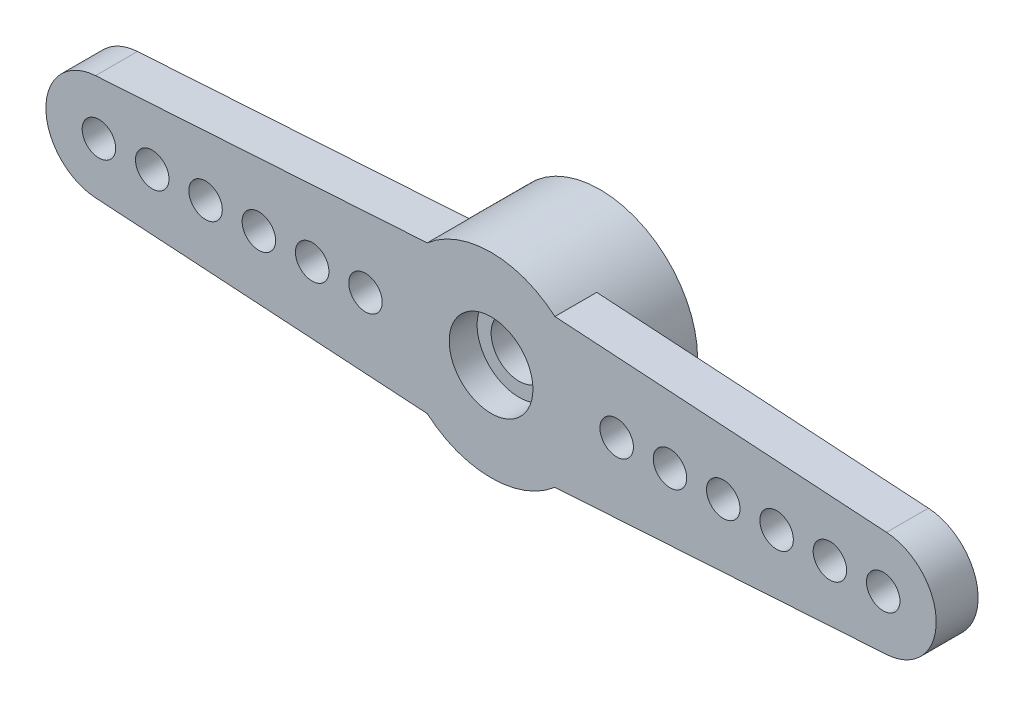
ISO-10303-21;
HEADER;
FILE_DESCRIPTION(('STEP AP214'),'2;1');
FILE_NAME('part.step','',(''),(''),'','','');
FILE_SCHEMA(('AUTOMOTIVE_DESIGN { 1 0 10303 214 1 1 1 1 }'));
ENDSEC;
DATA;
#1=APPLICATION_CONTEXT('core data for automotive mechanical design processes');
#2=APPLICATION_PROTOCOL_DEFINITION('international standard','automotive_design',2000,#1);
#3=PRODUCT_CONTEXT('',#1,'mechanical');
#4=PRODUCT('Part','Part','',(#3));
#5=PRODUCT_RELATED_PRODUCT_CATEGORY('part','',(#4));
#6=PRODUCT_DEFINITION_FORMATION('','',#4);
#7=PRODUCT_DEFINITION_CONTEXT('part definition',#1,'design');
#8=PRODUCT_DEFINITION('design','',#6,#7);
#9=PRODUCT_DEFINITION_SHAPE('','',#8);
#10=(LENGTH_UNIT() NAMED_UNIT(*) SI_UNIT(.MILLI.,.METRE.));
#11=(NAMED_UNIT(*) PLANE_ANGLE_UNIT() SI_UNIT($,.RADIAN.));
#12=(NAMED_UNIT(*) SI_UNIT($,.STERADIAN.) SOLID_ANGLE_UNIT());
#13=UNCERTAINTY_MEASURE_WITH_UNIT(LENGTH_MEASURE(1.E-05),#10,'distance_accuracy_value','');
#14=(GEOMETRIC_REPRESENTATION_CONTEXT(3) GLOBAL_UNCERTAINTY_ASSIGNED_CONTEXT((#13)) GLOBAL_UNIT_ASSIGNED_CONTEXT((#10,
#11,#12)) REPRESENTATION_CONTEXT('',''));
#15=CARTESIAN_POINT('',(0.,0.,0.));
#16=DIRECTION('',(0.,0.,1.));
#17=DIRECTION('',(1.,0.,0.));
#18=AXIS2_PLACEMENT_3D('',#15,#16,#17);
#19=CARTESIAN_POINT('',(0.,0.,3.9));
#20=DIRECTION('',(0.,0.,-1.));
#21=DIRECTION('',(-1.,0.,0.));
#22=AXIS2_PLACEMENT_3D('',#19,#20,#21);
#23=CYLINDRICAL_SURFACE('',#22,3.5);
#24=CARTESIAN_POINT('',(0.,0.,0.));
#25=DIRECTION('',(0.,0.,1.));
#26=DIRECTION('',(1.,0.,0.));
#27=AXIS2_PLACEMENT_3D('',#24,#25,#26);
#28=CIRCLE('',#27,3.5);
#29=CARTESIAN_POINT('',(3.5,0.,0.));
#30=VERTEX_POINT('',#29);
#31=EDGE_CURVE('E376',#30,#30,#28,.T.);
#32=ORIENTED_EDGE('',*,*,#31,.T.);
#33=EDGE_LOOP('',(#32));
#34=FACE_BOUND('',#33,.T.);
#35=DIRECTION('',(0.,0.,1.));
#36=VECTOR('',#35,1.);
#37=CARTESIAN_POINT('',(-2.28637267303474,2.65,2.4));
#38=LINE('',#37,#36);
#39=CARTESIAN_POINT('',(-2.28637267303474,2.65,2.4));
#40=VERTEX_POINT('',#39);
#41=CARTESIAN_POINT('',(-2.28637267303474,2.65,3.9));
#42=VERTEX_POINT('',#41);
#43=EDGE_CURVE('E317',#40,#42,#38,.T.);
#44=ORIENTED_EDGE('',*,*,#43,.T.);
#45=CARTESIAN_POINT('',(0.,0.,3.9));
#46=DIRECTION('',(0.,0.,1.));
#47=DIRECTION('',(1.,0.,0.));
#48=AXIS2_PLACEMENT_3D('',#45,#46,#47);
#49=CIRCLE('',#48,3.5);
#50=CARTESIAN_POINT('',(2.28637267303474,2.65,3.9));
#51=VERTEX_POINT('',#50);
#52=EDGE_CURVE('E12',#51,#42,#49,.T.);
#53=ORIENTED_EDGE('',*,*,#52,.F.);
#54=DIRECTION('',(0.,0.,1.));
#55=VECTOR('',#54,1.);
#56=CARTESIAN_POINT('',(2.28637267303474,2.65,2.4));
#57=LINE('',#56,#55);
#58=CARTESIAN_POINT('',(2.28637267303474,2.65,2.4));
#59=VERTEX_POINT('',#58);
#60=EDGE_CURVE('E368',#59,#51,#57,.T.);
#61=ORIENTED_EDGE('',*,*,#60,.F.);
#62=CARTESIAN_POINT('',(0.,0.,2.4));
#63=DIRECTION('',(0.,0.,1.));
#64=DIRECTION('',(1.,0.,0.));
#65=AXIS2_PLACEMENT_3D('',#62,#63,#64);
#66=CIRCLE('',#65,3.5);
#67=CARTESIAN_POINT('',(2.28637267303473,-2.65,2.4));
#68=VERTEX_POINT('',#67);
#69=EDGE_CURVE('E359',#68,#59,#66,.T.);
#70=ORIENTED_EDGE('',*,*,#69,.F.);
#71=DIRECTION('',(0.,0.,1.));
#72=VECTOR('',#71,1.);
#73=CARTESIAN_POINT('',(2.28637267303473,-2.65,2.4));
#74=LINE('',#73,#72);
#75=CARTESIAN_POINT('',(2.28637267303473,-2.65,3.9));
#76=VERTEX_POINT('',#75);
#77=EDGE_CURVE('E379',#68,#76,#74,.T.);
#78=ORIENTED_EDGE('',*,*,#77,.T.);
#79=CARTESIAN_POINT('',(-2.28637267303473,-2.65,3.9));
#80=VERTEX_POINT('',#79);
#81=EDGE_CURVE('E223',#80,#76,#49,.T.);
#82=ORIENTED_EDGE('',*,*,#81,.F.);
#83=DIRECTION('',(0.,0.,1.));
#84=VECTOR('',#83,1.);
#85=CARTESIAN_POINT('',(-2.28637267303474,-2.65,2.4));
#86=LINE('',#85,#84);
#87=CARTESIAN_POINT('',(-2.28637267303474,-2.65,2.4));
#88=VERTEX_POINT('',#87);
#89=EDGE_CURVE('E296',#88,#80,#86,.T.);
#90=ORIENTED_EDGE('',*,*,#89,.F.);
#91=CARTESIAN_POINT('',(0.,0.,2.4));
#92=DIRECTION('',(0.,0.,1.));
#93=DIRECTION('',(1.,0.,0.));
#94=AXIS2_PLACEMENT_3D('',#91,#92,#93);
#95=CIRCLE('',#94,3.5);
#96=EDGE_CURVE('E288',#40,#88,#95,.T.);
#97=ORIENTED_EDGE('',*,*,#96,.F.);
#98=EDGE_LOOP('',(#44,#53,#61,#70,#78,#82,#90,#97));
#99=FACE_BOUND('',#98,.T.);
#100=ADVANCED_FACE('F215',(#34,#99),#23,.T.);
#101=CARTESIAN_POINT('',(0.,0.,3.9));
#102=DIRECTION('',(0.,0.,1.));
#103=DIRECTION('',(1.,0.,0.));
#104=AXIS2_PLACEMENT_3D('',#101,#102,#103);
#105=PLANE('',#104);
#106=CARTESIAN_POINT('',(0.,0.,3.9));
#107=DIRECTION('',(0.,0.,1.));
#108=DIRECTION('',(1.,0.,0.));
#109=AXIS2_PLACEMENT_3D('',#106,#107,#108);
#110=CIRCLE('',#109,1.5);
#111=CARTESIAN_POINT('',(1.5,0.,3.9));
#112=VERTEX_POINT('',#111);
#113=EDGE_CURVE('E427',#112,#112,#110,.T.);
#114=ORIENTED_EDGE('',*,*,#113,.F.);
#115=EDGE_LOOP('',(#114));
#116=FACE_BOUND('',#115,.T.);
#117=ORIENTED_EDGE('',*,*,#52,.T.);
#118=DIRECTION('',(0.99799428926586,0.0633040171926833,0.));
#119=VECTOR('',#118,1.);
#120=CARTESIAN_POINT('',(-0.176581582893976,2.78382666902983,3.9));
#121=LINE('',#120,#119);
#122=CARTESIAN_POINT('',(-14.1702776326661,1.89618914960513,3.9));
#123=VERTEX_POINT('',#122);
#124=EDGE_CURVE('E302',#123,#42,#121,.T.);
#125=ORIENTED_EDGE('',*,*,#124,.F.);
#126=CARTESIAN_POINT('',(-14.05,0.,3.9));
#127=DIRECTION('',(0.,0.,1.));
#128=DIRECTION('',(1.,0.,0.));
#129=AXIS2_PLACEMENT_3D('',#126,#127,#128);
#130=CIRCLE('',#129,1.9);
#131=CARTESIAN_POINT('',(-14.1702776326661,-1.89618914960513,3.9));
#132=VERTEX_POINT('',#131);
#133=EDGE_CURVE('E311',#123,#132,#130,.T.);
#134=ORIENTED_EDGE('',*,*,#133,.T.);
#135=DIRECTION('',(-0.99799428926586,0.0633040171926834,0.));
#136=VECTOR('',#135,1.);
#137=CARTESIAN_POINT('',(-0.176581582893977,-2.78382666902983,3.9));
#138=LINE('',#137,#136);
#139=EDGE_CURVE('E231',#80,#132,#138,.T.);
#140=ORIENTED_EDGE('',*,*,#139,.F.);
#141=ORIENTED_EDGE('',*,*,#81,.T.);
#142=DIRECTION('',(0.99799428926586,0.0633040171926834,0.));
#143=VECTOR('',#142,1.);
#144=CARTESIAN_POINT('',(0.176581582893977,-2.78382666902983,3.9));
#145=LINE('',#144,#143);
#146=CARTESIAN_POINT('',(14.1702776326661,-1.89618914960513,3.9));
#147=VERTEX_POINT('',#146);
#148=EDGE_CURVE('E370',#76,#147,#145,.T.);
#149=ORIENTED_EDGE('',*,*,#148,.T.);
#150=CARTESIAN_POINT('',(14.05,0.,3.9));
#151=DIRECTION('',(0.,0.,1.));
#152=DIRECTION('',(1.,0.,0.));
#153=AXIS2_PLACEMENT_3D('',#150,#151,#152);
#154=CIRCLE('',#153,1.9);
#155=CARTESIAN_POINT('',(14.1702776326661,1.89618914960513,3.9));
#156=VERTEX_POINT('',#155);
#157=EDGE_CURVE('E360',#147,#156,#154,.T.);
#158=ORIENTED_EDGE('',*,*,#157,.T.);
#159=DIRECTION('',(-0.99799428926586,0.0633040171926833,0.));
#160=VECTOR('',#159,1.);
#161=CARTESIAN_POINT('',(0.176581582893976,2.78382666902983,3.9));
#162=LINE('',#161,#160);
#163=EDGE_CURVE('E237',#156,#51,#162,.T.);
#164=ORIENTED_EDGE('',*,*,#163,.T.);
#165=EDGE_LOOP('',(#117,#125,#134,#140,#141,#149,#158,#164));
#166=FACE_BOUND('',#165,.T.);
#167=CARTESIAN_POINT('',(14.05,0.,3.9));
#168=DIRECTION('',(0.,0.,1.));
#169=DIRECTION('',(1.,0.,0.));
#170=AXIS2_PLACEMENT_3D('',#167,#168,#169);
#171=CIRCLE('',#170,0.6);
#172=CARTESIAN_POINT('',(14.65,0.,3.9));
#173=VERTEX_POINT('',#172);
#174=EDGE_CURVE('E316',#173,#173,#171,.T.);
#175=ORIENTED_EDGE('',*,*,#174,.F.);
#176=EDGE_LOOP('',(#175));
#177=FACE_BOUND('',#176,.T.);
#178=CARTESIAN_POINT('',(12.14,0.,3.9));
#179=DIRECTION('',(0.,0.,1.));
#180=DIRECTION('',(1.,0.,0.));
#181=AXIS2_PLACEMENT_3D('',#178,#179,#180);
#182=CIRCLE('',#181,0.6);
#183=CARTESIAN_POINT('',(12.74,0.,3.9));
#184=VERTEX_POINT('',#183);
#185=EDGE_CURVE('E324',#184,#184,#182,.T.);
#186=ORIENTED_EDGE('',*,*,#185,.F.);
#187=EDGE_LOOP('',(#186));
#188=FACE_BOUND('',#187,.T.);
#189=CARTESIAN_POINT('',(10.23,0.,3.9));
#190=DIRECTION('',(0.,0.,1.));
#191=DIRECTION('',(1.,0.,0.));
#192=AXIS2_PLACEMENT_3D('',#189,#190,#191);
#193=CIRCLE('',#192,0.6);
#194=CARTESIAN_POINT('',(10.83,0.,3.9));
#195=VERTEX_POINT('',#194);
#196=EDGE_CURVE('E330',#195,#195,#193,.T.);
#197=ORIENTED_EDGE('',*,*,#196,.F.);
#198=EDGE_LOOP('',(#197));
#199=FACE_BOUND('',#198,.T.);
#200=CARTESIAN_POINT('',(8.32,0.,3.9));
#201=DIRECTION('',(0.,0.,1.));
#202=DIRECTION('',(1.,0.,0.));
#203=AXIS2_PLACEMENT_3D('',#200,#201,#202);
#204=CIRCLE('',#203,0.6);
#205=CARTESIAN_POINT('',(8.92,0.,3.9));
#206=VERTEX_POINT('',#205);
#207=EDGE_CURVE('E336',#206,#206,#204,.T.);
#208=ORIENTED_EDGE('',*,*,#207,.F.);
#209=EDGE_LOOP('',(#208));
#210=FACE_BOUND('',#209,.T.);
#211=CARTESIAN_POINT('',(6.41,0.,3.9));
#212=DIRECTION('',(0.,0.,1.));
#213=DIRECTION('',(1.,0.,0.));
#214=AXIS2_PLACEMENT_3D('',#211,#212,#213);
#215=CIRCLE('',#214,0.6);
#216=CARTESIAN_POINT('',(7.01,0.,3.9));
#217=VERTEX_POINT('',#216);
#218=EDGE_CURVE('E342',#217,#217,#215,.T.);
#219=ORIENTED_EDGE('',*,*,#218,.F.);
#220=EDGE_LOOP('',(#219));
#221=FACE_BOUND('',#220,.T.);
#222=CARTESIAN_POINT('',(4.5,0.,3.9));
#223=DIRECTION('',(0.,0.,1.));
#224=DIRECTION('',(1.,0.,0.));
#225=AXIS2_PLACEMENT_3D('',#222,#223,#224);
#226=CIRCLE('',#225,0.6);
#227=CARTESIAN_POINT('',(5.1,0.,3.9));
#228=VERTEX_POINT('',#227);
#229=EDGE_CURVE('E348',#228,#228,#226,.T.);
#230=ORIENTED_EDGE('',*,*,#229,.F.);
#231=EDGE_LOOP('',(#230));
#232=FACE_BOUND('',#231,.T.);
#233=CARTESIAN_POINT('',(-14.05,0.,3.9));
#234=DIRECTION('',(0.,0.,1.));
#235=DIRECTION('',(1.,0.,0.));
#236=AXIS2_PLACEMENT_3D('',#233,#234,#235);
#237=CIRCLE('',#236,0.6);
#238=CARTESIAN_POINT('',(-13.45,0.,3.9));
#239=VERTEX_POINT('',#238);
#240=EDGE_CURVE('E441',#239,#239,#237,.T.);
#241=ORIENTED_EDGE('',*,*,#240,.F.);
#242=EDGE_LOOP('',(#241));
#243=FACE_BOUND('',#242,.T.);
#244=CARTESIAN_POINT('',(-12.14,0.,3.9));
#245=DIRECTION('',(0.,0.,1.));
#246=DIRECTION('',(1.,0.,0.));
#247=AXIS2_PLACEMENT_3D('',#244,#245,#246);
#248=CIRCLE('',#247,0.6);
#249=CARTESIAN_POINT('',(-11.54,0.,3.9));
#250=VERTEX_POINT('',#249);
#251=EDGE_CURVE('E447',#250,#250,#248,.T.);
#252=ORIENTED_EDGE('',*,*,#251,.F.);
#253=EDGE_LOOP('',(#252));
#254=FACE_BOUND('',#253,.T.);
#255=CARTESIAN_POINT('',(-10.23,0.,3.9));
#256=DIRECTION('',(0.,0.,1.));
#257=DIRECTION('',(1.,0.,0.));
#258=AXIS2_PLACEMENT_3D('',#255,#256,#257);
#259=CIRCLE('',#258,0.6);
#260=CARTESIAN_POINT('',(-9.63,0.,3.9));
#261=VERTEX_POINT('',#260);
#262=EDGE_CURVE('E453',#261,#261,#259,.T.);
#263=ORIENTED_EDGE('',*,*,#262,.F.);
#264=EDGE_LOOP('',(#263));
#265=FACE_BOUND('',#264,.T.);
#266=CARTESIAN_POINT('',(-8.32,0.,3.9));
#267=DIRECTION('',(0.,0.,1.));
#268=DIRECTION('',(1.,0.,0.));
#269=AXIS2_PLACEMENT_3D('',#266,#267,#268);
#270=CIRCLE('',#269,0.6);
#271=CARTESIAN_POINT('',(-7.72,0.,3.9));
#272=VERTEX_POINT('',#271);
#273=EDGE_CURVE('E459',#272,#272,#270,.T.);
#274=ORIENTED_EDGE('',*,*,#273,.F.);
#275=EDGE_LOOP('',(#274));
#276=FACE_BOUND('',#275,.T.);
#277=CARTESIAN_POINT('',(-6.41,0.,3.9));
#278=DIRECTION('',(0.,0.,1.));
#279=DIRECTION('',(1.,0.,0.));
#280=AXIS2_PLACEMENT_3D('',#277,#278,#279);
#281=CIRCLE('',#280,0.6);
#282=CARTESIAN_POINT('',(-5.81,0.,3.9));
#283=VERTEX_POINT('',#282);
#284=EDGE_CURVE('E465',#283,#283,#281,.T.);
#285=ORIENTED_EDGE('',*,*,#284,.F.);
#286=EDGE_LOOP('',(#285));
#287=FACE_BOUND('',#286,.T.);
#288=CARTESIAN_POINT('',(-4.5,0.,3.9));
#289=DIRECTION('',(0.,0.,1.));
#290=DIRECTION('',(1.,0.,0.));
#291=AXIS2_PLACEMENT_3D('',#288,#289,#290);
#292=CIRCLE('',#291,0.6);
#293=CARTESIAN_POINT('',(-3.9,0.,3.9));
#294=VERTEX_POINT('',#293);
#295=EDGE_CURVE('E306',#294,#294,#292,.T.);
#296=ORIENTED_EDGE('',*,*,#295,.F.);
#297=EDGE_LOOP('',(#296));
#298=FACE_BOUND('',#297,.T.);
#299=ADVANCED_FACE('F387',(#116,#166,#177,#188,#199,#210,#221,#232,#243,#254,#265,#276,#287,
#298),#105,.T.);
#300=CARTESIAN_POINT('',(0.,0.,0.));
#301=DIRECTION('',(0.,0.,1.));
#302=DIRECTION('',(1.,0.,0.));
#303=AXIS2_PLACEMENT_3D('',#300,#301,#302);
#304=PLANE('',#303);
#305=CARTESIAN_POINT('',(0.,0.,0.));
#306=DIRECTION('',(0.,0.,1.));
#307=DIRECTION('',(1.,0.,0.));
#308=AXIS2_PLACEMENT_3D('',#305,#306,#307);
#309=CIRCLE('',#308,2.5);
#310=CARTESIAN_POINT('',(2.5,0.,0.));
#311=VERTEX_POINT('',#310);
#312=EDGE_CURVE('E433',#311,#311,#309,.T.);
#313=ORIENTED_EDGE('',*,*,#312,.T.);
#314=EDGE_LOOP('',(#313));
#315=FACE_BOUND('',#314,.T.);
#316=ORIENTED_EDGE('',*,*,#31,.F.);
#317=EDGE_LOOP('',(#316));
#318=FACE_BOUND('',#317,.T.);
#319=ADVANCED_FACE('F412',(#315,#318),#304,.F.);
#320=CARTESIAN_POINT('',(0.176581582893976,2.78382666902983,2.4));
#321=DIRECTION('',(0.0633040171926833,0.99799428926586,0.));
#322=DIRECTION('',(-0.99799428926586,0.0633040171926833,0.));
#323=AXIS2_PLACEMENT_3D('',#320,#321,#322);
#324=PLANE('',#323);
#325=ORIENTED_EDGE('',*,*,#163,.F.);
#326=DIRECTION('',(0.,0.,1.));
#327=VECTOR('',#326,1.);
#328=CARTESIAN_POINT('',(14.1702776326661,1.89618914960513,2.4));
#329=LINE('',#328,#327);
#330=CARTESIAN_POINT('',(14.1702776326661,1.89618914960513,2.4));
#331=VERTEX_POINT('',#330);
#332=EDGE_CURVE('E374',#331,#156,#329,.T.);
#333=ORIENTED_EDGE('',*,*,#332,.F.);
#334=DIRECTION('',(-0.99799428926586,0.0633040171926833,0.));
#335=VECTOR('',#334,1.);
#336=CARTESIAN_POINT('',(0.176581582893976,2.78382666902983,2.4));
#337=LINE('',#336,#335);
#338=EDGE_CURVE('E356',#331,#59,#337,.T.);
#339=ORIENTED_EDGE('',*,*,#338,.T.);
#340=ORIENTED_EDGE('',*,*,#60,.T.);
#341=EDGE_LOOP('',(#325,#333,#339,#340));
#342=FACE_BOUND('',#341,.T.);
#343=ADVANCED_FACE('F402',(#342),#324,.T.);
#344=CARTESIAN_POINT('',(14.05,0.,2.4));
#345=DIRECTION('',(0.,0.,1.));
#346=DIRECTION('',(1.,0.,0.));
#347=AXIS2_PLACEMENT_3D('',#344,#345,#346);
#348=CYLINDRICAL_SURFACE('',#347,1.9);
#349=ORIENTED_EDGE('',*,*,#157,.F.);
#350=DIRECTION('',(0.,0.,1.));
#351=VECTOR('',#350,1.);
#352=CARTESIAN_POINT('',(14.1702776326661,-1.89618914960513,2.4));
#353=LINE('',#352,#351);
#354=CARTESIAN_POINT('',(14.1702776326661,-1.89618914960513,2.4));
#355=VERTEX_POINT('',#354);
#356=EDGE_CURVE('E377',#355,#147,#353,.T.);
#357=ORIENTED_EDGE('',*,*,#356,.F.);
#358=CARTESIAN_POINT('',(14.05,0.,2.4));
#359=DIRECTION('',(0.,0.,1.));
#360=DIRECTION('',(1.,0.,0.));
#361=AXIS2_PLACEMENT_3D('',#358,#359,#360);
#362=CIRCLE('',#361,1.9);
#363=EDGE_CURVE('E365',#355,#331,#362,.T.);
#364=ORIENTED_EDGE('',*,*,#363,.T.);
#365=ORIENTED_EDGE('',*,*,#332,.T.);
#366=EDGE_LOOP('',(#349,#357,#364,#365));
#367=FACE_BOUND('',#366,.T.);
#368=ADVANCED_FACE('F404',(#367),#348,.T.);
#369=CARTESIAN_POINT('',(0.176581582893977,-2.78382666902983,2.4));
#370=DIRECTION('',(0.0633040171926833,-0.99799428926586,0.));
#371=DIRECTION('',(0.99799428926586,0.0633040171926834,0.));
#372=AXIS2_PLACEMENT_3D('',#369,#370,#371);
#373=PLANE('',#372);
#374=ORIENTED_EDGE('',*,*,#148,.F.);
#375=ORIENTED_EDGE('',*,*,#77,.F.);
#376=DIRECTION('',(0.99799428926586,0.0633040171926834,0.));
#377=VECTOR('',#376,1.);
#378=CARTESIAN_POINT('',(0.176581582893977,-2.78382666902983,2.4));
#379=LINE('',#378,#377);
#380=EDGE_CURVE('E362',#68,#355,#379,.T.);
#381=ORIENTED_EDGE('',*,*,#380,.T.);
#382=ORIENTED_EDGE('',*,*,#356,.T.);
#383=EDGE_LOOP('',(#374,#375,#381,#382));
#384=FACE_BOUND('',#383,.T.);
#385=ADVANCED_FACE('F392',(#384),#373,.T.);
#386=CARTESIAN_POINT('',(0.,0.,2.4));
#387=DIRECTION('',(0.,0.,1.));
#388=DIRECTION('',(1.,0.,0.));
#389=AXIS2_PLACEMENT_3D('',#386,#387,#388);
#390=PLANE('',#389);
#391=CARTESIAN_POINT('',(14.05,0.,2.4));
#392=DIRECTION('',(0.,0.,1.));
#393=DIRECTION('',(1.,0.,0.));
#394=AXIS2_PLACEMENT_3D('',#391,#392,#393);
#395=CIRCLE('',#394,0.6);
#396=CARTESIAN_POINT('',(14.65,0.,2.4));
#397=VERTEX_POINT('',#396);
#398=EDGE_CURVE('E321',#397,#397,#395,.T.);
#399=ORIENTED_EDGE('',*,*,#398,.T.);
#400=EDGE_LOOP('',(#399));
#401=FACE_BOUND('',#400,.T.);
#402=CARTESIAN_POINT('',(12.14,0.,2.4));
#403=DIRECTION('',(0.,0.,1.));
#404=DIRECTION('',(1.,0.,0.));
#405=AXIS2_PLACEMENT_3D('',#402,#403,#404);
#406=CIRCLE('',#405,0.6);
#407=CARTESIAN_POINT('',(12.74,0.,2.4));
#408=VERTEX_POINT('',#407);
#409=EDGE_CURVE('E327',#408,#408,#406,.T.);
#410=ORIENTED_EDGE('',*,*,#409,.T.);
#411=EDGE_LOOP('',(#410));
#412=FACE_BOUND('',#411,.T.);
#413=CARTESIAN_POINT('',(10.23,0.,2.4));
#414=DIRECTION('',(0.,0.,1.));
#415=DIRECTION('',(1.,0.,0.));
#416=AXIS2_PLACEMENT_3D('',#413,#414,#415);
#417=CIRCLE('',#416,0.6);
#418=CARTESIAN_POINT('',(10.83,0.,2.4));
#419=VERTEX_POINT('',#418);
#420=EDGE_CURVE('E333',#419,#419,#417,.T.);
#421=ORIENTED_EDGE('',*,*,#420,.T.);
#422=EDGE_LOOP('',(#421));
#423=FACE_BOUND('',#422,.T.);
#424=CARTESIAN_POINT('',(8.32,0.,2.4));
#425=DIRECTION('',(0.,0.,1.));
#426=DIRECTION('',(1.,0.,0.));
#427=AXIS2_PLACEMENT_3D('',#424,#425,#426);
#428=CIRCLE('',#427,0.6);
#429=CARTESIAN_POINT('',(8.92,0.,2.4));
#430=VERTEX_POINT('',#429);
#431=EDGE_CURVE('E339',#430,#430,#428,.T.);
#432=ORIENTED_EDGE('',*,*,#431,.T.);
#433=EDGE_LOOP('',(#432));
#434=FACE_BOUND('',#433,.T.);
#435=CARTESIAN_POINT('',(6.41,0.,2.4));
#436=DIRECTION('',(0.,0.,1.));
#437=DIRECTION('',(1.,0.,0.));
#438=AXIS2_PLACEMENT_3D('',#435,#436,#437);
#439=CIRCLE('',#438,0.6);
#440=CARTESIAN_POINT('',(7.01,0.,2.4));
#441=VERTEX_POINT('',#440);
#442=EDGE_CURVE('E345',#441,#441,#439,.T.);
#443=ORIENTED_EDGE('',*,*,#442,.T.);
#444=EDGE_LOOP('',(#443));
#445=FACE_BOUND('',#444,.T.);
#446=CARTESIAN_POINT('',(4.5,0.,2.4));
#447=DIRECTION('',(0.,0.,1.));
#448=DIRECTION('',(1.,0.,0.));
#449=AXIS2_PLACEMENT_3D('',#446,#447,#448);
#450=CIRCLE('',#449,0.6);
#451=CARTESIAN_POINT('',(5.1,0.,2.4));
#452=VERTEX_POINT('',#451);
#453=EDGE_CURVE('E351',#452,#452,#450,.T.);
#454=ORIENTED_EDGE('',*,*,#453,.T.);
#455=EDGE_LOOP('',(#454));
#456=FACE_BOUND('',#455,.T.);
#457=ORIENTED_EDGE('',*,*,#338,.F.);
#458=ORIENTED_EDGE('',*,*,#363,.F.);
#459=ORIENTED_EDGE('',*,*,#380,.F.);
#460=ORIENTED_EDGE('',*,*,#69,.T.);
#461=EDGE_LOOP('',(#457,#458,#459,#460));
#462=FACE_BOUND('',#461,.T.);
#463=ADVANCED_FACE('F399',(#401,#412,#423,#434,#445,#456,#462),#390,.F.);
#464=CARTESIAN_POINT('',(4.5,0.,2.4));
#465=DIRECTION('',(0.,0.,1.));
#466=DIRECTION('',(1.,0.,0.));
#467=AXIS2_PLACEMENT_3D('',#464,#465,#466);
#468=CYLINDRICAL_SURFACE('',#467,0.6);
#469=ORIENTED_EDGE('',*,*,#453,.F.);
#470=EDGE_LOOP('',(#469));
#471=FACE_BOUND('',#470,.T.);
#472=ORIENTED_EDGE('',*,*,#229,.T.);
#473=EDGE_LOOP('',(#472));
#474=FACE_BOUND('',#473,.T.);
#475=ADVANCED_FACE('F522',(#471,#474),#468,.F.);
#476=CARTESIAN_POINT('',(6.41,0.,2.4));
#477=DIRECTION('',(0.,0.,1.));
#478=DIRECTION('',(1.,0.,0.));
#479=AXIS2_PLACEMENT_3D('',#476,#477,#478);
#480=CYLINDRICAL_SURFACE('',#479,0.6);
#481=ORIENTED_EDGE('',*,*,#442,.F.);
#482=EDGE_LOOP('',(#481));
#483=FACE_BOUND('',#482,.T.);
#484=ORIENTED_EDGE('',*,*,#218,.T.);
#485=EDGE_LOOP('',(#484));
#486=FACE_BOUND('',#485,.T.);
#487=ADVANCED_FACE('F518',(#483,#486),#480,.F.);
#488=CARTESIAN_POINT('',(8.32,0.,2.4));
#489=DIRECTION('',(0.,0.,1.));
#490=DIRECTION('',(1.,0.,0.));
#491=AXIS2_PLACEMENT_3D('',#488,#489,#490);
#492=CYLINDRICAL_SURFACE('',#491,0.6);
#493=ORIENTED_EDGE('',*,*,#431,.F.);
#494=EDGE_LOOP('',(#493));
#495=FACE_BOUND('',#494,.T.);
#496=ORIENTED_EDGE('',*,*,#207,.T.);
#497=EDGE_LOOP('',(#496));
#498=FACE_BOUND('',#497,.T.);
#499=ADVANCED_FACE('F514',(#495,#498),#492,.F.);
#500=CARTESIAN_POINT('',(10.23,0.,2.4));
#501=DIRECTION('',(0.,0.,1.));
#502=DIRECTION('',(1.,0.,0.));
#503=AXIS2_PLACEMENT_3D('',#500,#501,#502);
#504=CYLINDRICAL_SURFACE('',#503,0.6);
#505=ORIENTED_EDGE('',*,*,#420,.F.);
#506=EDGE_LOOP('',(#505));
#507=FACE_BOUND('',#506,.T.);
#508=ORIENTED_EDGE('',*,*,#196,.T.);
#509=EDGE_LOOP('',(#508));
#510=FACE_BOUND('',#509,.T.);
#511=ADVANCED_FACE('F510',(#507,#510),#504,.F.);
#512=CARTESIAN_POINT('',(12.14,0.,2.4));
#513=DIRECTION('',(0.,0.,1.));
#514=DIRECTION('',(1.,0.,0.));
#515=AXIS2_PLACEMENT_3D('',#512,#513,#514);
#516=CYLINDRICAL_SURFACE('',#515,0.6);
#517=ORIENTED_EDGE('',*,*,#409,.F.);
#518=EDGE_LOOP('',(#517));
#519=FACE_BOUND('',#518,.T.);
#520=ORIENTED_EDGE('',*,*,#185,.T.);
#521=EDGE_LOOP('',(#520));
#522=FACE_BOUND('',#521,.T.);
#523=ADVANCED_FACE('F506',(#519,#522),#516,.F.);
#524=CARTESIAN_POINT('',(14.05,0.,2.4));
#525=DIRECTION('',(0.,0.,1.));
#526=DIRECTION('',(1.,0.,0.));
#527=AXIS2_PLACEMENT_3D('',#524,#525,#526);
#528=CYLINDRICAL_SURFACE('',#527,0.6);
#529=ORIENTED_EDGE('',*,*,#398,.F.);
#530=EDGE_LOOP('',(#529));
#531=FACE_BOUND('',#530,.T.);
#532=ORIENTED_EDGE('',*,*,#174,.T.);
#533=EDGE_LOOP('',(#532));
#534=FACE_BOUND('',#533,.T.);
#535=ADVANCED_FACE('F503',(#531,#534),#528,.F.);
#536=CARTESIAN_POINT('',(-14.05,0.,2.4));
#537=DIRECTION('',(0.,0.,1.));
#538=DIRECTION('',(1.,0.,0.));
#539=AXIS2_PLACEMENT_3D('',#536,#537,#538);
#540=CYLINDRICAL_SURFACE('',#539,1.9);
#541=ORIENTED_EDGE('',*,*,#133,.F.);
#542=DIRECTION('',(0.,0.,1.));
#543=VECTOR('',#542,1.);
#544=CARTESIAN_POINT('',(-14.1702776326661,1.89618914960513,2.4));
#545=LINE('',#544,#543);
#546=CARTESIAN_POINT('',(-14.1702776326661,1.89618914960513,2.4));
#547=VERTEX_POINT('',#546);
#548=EDGE_CURVE('E300',#547,#123,#545,.T.);
#549=ORIENTED_EDGE('',*,*,#548,.F.);
#550=CARTESIAN_POINT('',(-14.05,0.,2.4));
#551=DIRECTION('',(0.,0.,1.));
#552=DIRECTION('',(1.,0.,0.));
#553=AXIS2_PLACEMENT_3D('',#550,#551,#552);
#554=CIRCLE('',#553,1.9);
#555=CARTESIAN_POINT('',(-14.1702776326661,-1.89618914960513,2.4));
#556=VERTEX_POINT('',#555);
#557=EDGE_CURVE('E286',#547,#556,#554,.T.);
#558=ORIENTED_EDGE('',*,*,#557,.T.);
#559=DIRECTION('',(0.,0.,1.));
#560=VECTOR('',#559,1.);
#561=CARTESIAN_POINT('',(-14.1702776326661,-1.89618914960513,2.4));
#562=LINE('',#561,#560);
#563=EDGE_CURVE('E292',#556,#132,#562,.T.);
#564=ORIENTED_EDGE('',*,*,#563,.T.);
#565=EDGE_LOOP('',(#541,#549,#558,#564));
#566=FACE_BOUND('',#565,.T.);
#567=ADVANCED_FACE('F299',(#566),#540,.T.);
#568=CARTESIAN_POINT('',(-0.176581582893976,2.78382666902983,2.4));
#569=DIRECTION('',(0.0633040171926833,-0.99799428926586,0.));
#570=DIRECTION('',(0.99799428926586,0.0633040171926833,0.));
#571=AXIS2_PLACEMENT_3D('',#568,#569,#570);
#572=PLANE('',#571);
#573=ORIENTED_EDGE('',*,*,#124,.T.);
#574=ORIENTED_EDGE('',*,*,#43,.F.);
#575=DIRECTION('',(0.99799428926586,0.0633040171926833,0.));
#576=VECTOR('',#575,1.);
#577=CARTESIAN_POINT('',(-0.176581582893976,2.78382666902983,2.4));
#578=LINE('',#577,#576);
#579=EDGE_CURVE('E297',#547,#40,#578,.T.);
#580=ORIENTED_EDGE('',*,*,#579,.F.);
#581=ORIENTED_EDGE('',*,*,#548,.T.);
#582=EDGE_LOOP('',(#573,#574,#580,#581));
#583=FACE_BOUND('',#582,.T.);
#584=ADVANCED_FACE('F495',(#583),#572,.F.);
#585=CARTESIAN_POINT('',(-0.176581582893977,-2.78382666902983,2.4));
#586=DIRECTION('',(0.0633040171926833,0.99799428926586,0.));
#587=DIRECTION('',(-0.99799428926586,0.0633040171926834,0.));
#588=AXIS2_PLACEMENT_3D('',#585,#586,#587);
#589=PLANE('',#588);
#590=ORIENTED_EDGE('',*,*,#139,.T.);
#591=ORIENTED_EDGE('',*,*,#563,.F.);
#592=DIRECTION('',(-0.99799428926586,0.0633040171926834,0.));
#593=VECTOR('',#592,1.);
#594=CARTESIAN_POINT('',(-0.176581582893977,-2.78382666902983,2.4));
#595=LINE('',#594,#593);
#596=EDGE_CURVE('E282',#88,#556,#595,.T.);
#597=ORIENTED_EDGE('',*,*,#596,.F.);
#598=ORIENTED_EDGE('',*,*,#89,.T.);
#599=EDGE_LOOP('',(#590,#591,#597,#598));
#600=FACE_BOUND('',#599,.T.);
#601=ADVANCED_FACE('F293',(#600),#589,.F.);
#602=CARTESIAN_POINT('',(-14.05,0.,2.4));
#603=DIRECTION('',(0.,0.,1.));
#604=DIRECTION('',(1.,0.,0.));
#605=AXIS2_PLACEMENT_3D('',#602,#603,#604);
#606=PLANE('',#605);
#607=CARTESIAN_POINT('',(-14.05,0.,2.4));
#608=DIRECTION('',(0.,0.,1.));
#609=DIRECTION('',(1.,0.,0.));
#610=AXIS2_PLACEMENT_3D('',#607,#608,#609);
#611=CIRCLE('',#610,0.6);
#612=CARTESIAN_POINT('',(-13.45,0.,2.4));
#613=VERTEX_POINT('',#612);
#614=EDGE_CURVE('E444',#613,#613,#611,.T.);
#615=ORIENTED_EDGE('',*,*,#614,.T.);
#616=EDGE_LOOP('',(#615));
#617=FACE_BOUND('',#616,.T.);
#618=CARTESIAN_POINT('',(-12.14,0.,2.4));
#619=DIRECTION('',(0.,0.,1.));
#620=DIRECTION('',(1.,0.,0.));
#621=AXIS2_PLACEMENT_3D('',#618,#619,#620);
#622=CIRCLE('',#621,0.6);
#623=CARTESIAN_POINT('',(-11.54,0.,2.4));
#624=VERTEX_POINT('',#623);
#625=EDGE_CURVE('E450',#624,#624,#622,.T.);
#626=ORIENTED_EDGE('',*,*,#625,.T.);
#627=EDGE_LOOP('',(#626));
#628=FACE_BOUND('',#627,.T.);
#629=CARTESIAN_POINT('',(-10.23,0.,2.4));
#630=DIRECTION('',(0.,0.,1.));
#631=DIRECTION('',(1.,0.,0.));
#632=AXIS2_PLACEMENT_3D('',#629,#630,#631);
#633=CIRCLE('',#632,0.6);
#634=CARTESIAN_POINT('',(-9.63,0.,2.4));
#635=VERTEX_POINT('',#634);
#636=EDGE_CURVE('E456',#635,#635,#633,.T.);
#637=ORIENTED_EDGE('',*,*,#636,.T.);
#638=EDGE_LOOP('',(#637));
#639=FACE_BOUND('',#638,.T.);
#640=CARTESIAN_POINT('',(-8.32,0.,2.4));
#641=DIRECTION('',(0.,0.,1.));
#642=DIRECTION('',(1.,0.,0.));
#643=AXIS2_PLACEMENT_3D('',#640,#641,#642);
#644=CIRCLE('',#643,0.6);
#645=CARTESIAN_POINT('',(-7.72,0.,2.4));
#646=VERTEX_POINT('',#645);
#647=EDGE_CURVE('E462',#646,#646,#644,.T.);
#648=ORIENTED_EDGE('',*,*,#647,.T.);
#649=EDGE_LOOP('',(#648));
#650=FACE_BOUND('',#649,.T.);
#651=CARTESIAN_POINT('',(-6.41,0.,2.4));
#652=DIRECTION('',(0.,0.,1.));
#653=DIRECTION('',(1.,0.,0.));
#654=AXIS2_PLACEMENT_3D('',#651,#652,#653);
#655=CIRCLE('',#654,0.6);
#656=CARTESIAN_POINT('',(-5.81,0.,2.4));
#657=VERTEX_POINT('',#656);
#658=EDGE_CURVE('E468',#657,#657,#655,.T.);
#659=ORIENTED_EDGE('',*,*,#658,.T.);
#660=EDGE_LOOP('',(#659));
#661=FACE_BOUND('',#660,.T.);
#662=CARTESIAN_POINT('',(-4.5,0.,2.4));
#663=DIRECTION('',(0.,0.,1.));
#664=DIRECTION('',(1.,0.,0.));
#665=AXIS2_PLACEMENT_3D('',#662,#663,#664);
#666=CIRCLE('',#665,0.6);
#667=CARTESIAN_POINT('',(-3.9,0.,2.4));
#668=VERTEX_POINT('',#667);
#669=EDGE_CURVE('E313',#668,#668,#666,.T.);
#670=ORIENTED_EDGE('',*,*,#669,.T.);
#671=EDGE_LOOP('',(#670));
#672=FACE_BOUND('',#671,.T.);
#673=ORIENTED_EDGE('',*,*,#557,.F.);
#674=ORIENTED_EDGE('',*,*,#579,.T.);
#675=ORIENTED_EDGE('',*,*,#96,.T.);
#676=ORIENTED_EDGE('',*,*,#596,.T.);
#677=EDGE_LOOP('',(#673,#674,#675,#676));
#678=FACE_BOUND('',#677,.T.);
#679=ADVANCED_FACE('F284',(#617,#628,#639,#650,#661,#672,#678),#606,.F.);
#680=CARTESIAN_POINT('',(-4.5,0.,2.4));
#681=DIRECTION('',(0.,0.,1.));
#682=DIRECTION('',(1.,0.,0.));
#683=AXIS2_PLACEMENT_3D('',#680,#681,#682);
#684=CYLINDRICAL_SURFACE('',#683,0.6);
#685=ORIENTED_EDGE('',*,*,#669,.F.);
#686=EDGE_LOOP('',(#685));
#687=FACE_BOUND('',#686,.T.);
#688=ORIENTED_EDGE('',*,*,#295,.T.);
#689=EDGE_LOOP('',(#688));
#690=FACE_BOUND('',#689,.T.);
#691=ADVANCED_FACE('F478',(#687,#690),#684,.F.);
#692=CARTESIAN_POINT('',(-6.41,0.,2.4));
#693=DIRECTION('',(0.,0.,1.));
#694=DIRECTION('',(1.,0.,0.));
#695=AXIS2_PLACEMENT_3D('',#692,#693,#694);
#696=CYLINDRICAL_SURFACE('',#695,0.6);
#697=ORIENTED_EDGE('',*,*,#658,.F.);
#698=EDGE_LOOP('',(#697));
#699=FACE_BOUND('',#698,.T.);
#700=ORIENTED_EDGE('',*,*,#284,.T.);
#701=EDGE_LOOP('',(#700));
#702=FACE_BOUND('',#701,.T.);
#703=ADVANCED_FACE('F481',(#699,#702),#696,.F.);
#704=CARTESIAN_POINT('',(-8.32,0.,2.4));
#705=DIRECTION('',(0.,0.,1.));
#706=DIRECTION('',(1.,0.,0.));
#707=AXIS2_PLACEMENT_3D('',#704,#705,#706);
#708=CYLINDRICAL_SURFACE('',#707,0.6);
#709=ORIENTED_EDGE('',*,*,#647,.F.);
#710=EDGE_LOOP('',(#709));
#711=FACE_BOUND('',#710,.T.);
#712=ORIENTED_EDGE('',*,*,#273,.T.);
#713=EDGE_LOOP('',(#712));
#714=FACE_BOUND('',#713,.T.);
#715=ADVANCED_FACE('F488',(#711,#714),#708,.F.);
#716=CARTESIAN_POINT('',(-10.23,0.,2.4));
#717=DIRECTION('',(0.,0.,1.));
#718=DIRECTION('',(1.,0.,0.));
#719=AXIS2_PLACEMENT_3D('',#716,#717,#718);
#720=CYLINDRICAL_SURFACE('',#719,0.6);
#721=ORIENTED_EDGE('',*,*,#636,.F.);
#722=EDGE_LOOP('',(#721));
#723=FACE_BOUND('',#722,.T.);
#724=ORIENTED_EDGE('',*,*,#262,.T.);
#725=EDGE_LOOP('',(#724));
#726=FACE_BOUND('',#725,.T.);
#727=ADVANCED_FACE('F557',(#723,#726),#720,.F.);
#728=CARTESIAN_POINT('',(-12.14,0.,2.4));
#729=DIRECTION('',(0.,0.,1.));
#730=DIRECTION('',(1.,0.,0.));
#731=AXIS2_PLACEMENT_3D('',#728,#729,#730);
#732=CYLINDRICAL_SURFACE('',#731,0.6);
#733=ORIENTED_EDGE('',*,*,#625,.F.);
#734=EDGE_LOOP('',(#733));
#735=FACE_BOUND('',#734,.T.);
#736=ORIENTED_EDGE('',*,*,#251,.T.);
#737=EDGE_LOOP('',(#736));
#738=FACE_BOUND('',#737,.T.);
#739=ADVANCED_FACE('F562',(#735,#738),#732,.F.);
#740=CARTESIAN_POINT('',(-14.05,0.,2.4));
#741=DIRECTION('',(0.,0.,1.));
#742=DIRECTION('',(1.,0.,0.));
#743=AXIS2_PLACEMENT_3D('',#740,#741,#742);
#744=CYLINDRICAL_SURFACE('',#743,0.6);
#745=ORIENTED_EDGE('',*,*,#614,.F.);
#746=EDGE_LOOP('',(#745));
#747=FACE_BOUND('',#746,.T.);
#748=ORIENTED_EDGE('',*,*,#240,.T.);
#749=EDGE_LOOP('',(#748));
#750=FACE_BOUND('',#749,.T.);
#751=ADVANCED_FACE('F569',(#747,#750),#744,.F.);
#752=CARTESIAN_POINT('',(0.,0.,2.));
#753=DIRECTION('',(0.,0.,-1.));
#754=DIRECTION('',(-1.,0.,0.));
#755=AXIS2_PLACEMENT_3D('',#752,#753,#754);
#756=CYLINDRICAL_SURFACE('',#755,2.5);
#757=CARTESIAN_POINT('',(0.,0.,2.));
#758=DIRECTION('',(0.,0.,1.));
#759=DIRECTION('',(1.,0.,0.));
#760=AXIS2_PLACEMENT_3D('',#757,#758,#759);
#761=CIRCLE('',#760,2.5);
#762=CARTESIAN_POINT('',(2.5,0.,2.));
#763=VERTEX_POINT('',#762);
#764=EDGE_CURVE('E438',#763,#763,#761,.T.);
#765=ORIENTED_EDGE('',*,*,#764,.T.);
#766=EDGE_LOOP('',(#765));
#767=FACE_BOUND('',#766,.T.);
#768=ORIENTED_EDGE('',*,*,#312,.F.);
#769=EDGE_LOOP('',(#768));
#770=FACE_BOUND('',#769,.T.);
#771=ADVANCED_FACE('F573',(#767,#770),#756,.F.);
#772=CARTESIAN_POINT('',(0.,0.,2.));
#773=DIRECTION('',(0.,0.,1.));
#774=DIRECTION('',(1.,0.,0.));
#775=AXIS2_PLACEMENT_3D('',#772,#773,#774);
#776=PLANE('',#775);
#777=CARTESIAN_POINT('',(0.,0.,2.));
#778=DIRECTION('',(0.,0.,1.));
#779=DIRECTION('',(1.,0.,0.));
#780=AXIS2_PLACEMENT_3D('',#777,#778,#779);
#781=CIRCLE('',#780,1.);
#782=CARTESIAN_POINT('',(1.,0.,2.));
#783=VERTEX_POINT('',#782);
#784=EDGE_CURVE('E430',#783,#783,#781,.F.);
#785=ORIENTED_EDGE('',*,*,#784,.F.);
#786=EDGE_LOOP('',(#785));
#787=FACE_BOUND('',#786,.T.);
#788=ORIENTED_EDGE('',*,*,#764,.F.);
#789=EDGE_LOOP('',(#788));
#790=FACE_BOUND('',#789,.T.);
#791=ADVANCED_FACE('F577',(#787,#790),#776,.F.);
#792=CARTESIAN_POINT('',(0.,0.,2.9));
#793=DIRECTION('',(0.,0.,1.));
#794=DIRECTION('',(1.,0.,0.));
#795=AXIS2_PLACEMENT_3D('',#792,#793,#794);
#796=CYLINDRICAL_SURFACE('',#795,1.5);
#797=CARTESIAN_POINT('',(0.,0.,2.9));
#798=DIRECTION('',(0.,0.,1.));
#799=DIRECTION('',(1.,0.,0.));
#800=AXIS2_PLACEMENT_3D('',#797,#798,#799);
#801=CIRCLE('',#800,1.5);
#802=CARTESIAN_POINT('',(1.5,0.,2.9));
#803=VERTEX_POINT('',#802);
#804=EDGE_CURVE('E429',#803,#803,#801,.T.);
#805=ORIENTED_EDGE('',*,*,#804,.F.);
#806=EDGE_LOOP('',(#805));
#807=FACE_BOUND('',#806,.T.);
#808=ORIENTED_EDGE('',*,*,#113,.T.);
#809=EDGE_LOOP('',(#808));
#810=FACE_BOUND('',#809,.T.);
#811=ADVANCED_FACE('F581',(#807,#810),#796,.F.);
#812=CARTESIAN_POINT('',(0.,0.,2.9));
#813=DIRECTION('',(0.,0.,1.));
#814=DIRECTION('',(1.,0.,0.));
#815=AXIS2_PLACEMENT_3D('',#812,#813,#814);
#816=PLANE('',#815);
#817=CARTESIAN_POINT('',(0.,0.,2.9));
#818=DIRECTION('',(0.,0.,1.));
#819=DIRECTION('',(1.,0.,0.));
#820=AXIS2_PLACEMENT_3D('',#817,#818,#819);
#821=CIRCLE('',#820,1.);
#822=CARTESIAN_POINT('',(1.,0.,2.9));
#823=VERTEX_POINT('',#822);
#824=EDGE_CURVE('E218',#823,#823,#821,.F.);
#825=ORIENTED_EDGE('',*,*,#824,.T.);
#826=EDGE_LOOP('',(#825));
#827=FACE_BOUND('',#826,.T.);
#828=ORIENTED_EDGE('',*,*,#804,.T.);
#829=EDGE_LOOP('',(#828));
#830=FACE_BOUND('',#829,.T.);
#831=ADVANCED_FACE('F585',(#827,#830),#816,.T.);
#832=CARTESIAN_POINT('',(0.,0.,3.9));
#833=DIRECTION('',(0.,0.,-1.));
#834=DIRECTION('',(-1.,0.,0.));
#835=AXIS2_PLACEMENT_3D('',#832,#833,#834);
#836=CYLINDRICAL_SURFACE('',#835,1.);
#837=ORIENTED_EDGE('',*,*,#824,.F.);
#838=EDGE_LOOP('',(#837));
#839=FACE_BOUND('',#838,.T.);
#840=ORIENTED_EDGE('',*,*,#784,.T.);
#841=EDGE_LOOP('',(#840));
#842=FACE_BOUND('',#841,.T.);
#843=ADVANCED_FACE('F589',(#839,#842),#836,.F.);
#844=CLOSED_SHELL('',(#100,#299,#319,#343,#368,#385,#463,#475,#487,#499,#511,#523,#535,#567,
#584,#601,#679,#691,#703,#715,#727,#739,#751,#771,#791,#811,#831,#843));
#845=MANIFOLD_SOLID_BREP('B2',#844);
#846=ADVANCED_BREP_SHAPE_REPRESENTATION('',(#18,#845),#14);
#847=SHAPE_DEFINITION_REPRESENTATION(#9,#846);
ENDSEC;
END-ISO-10303-21;
